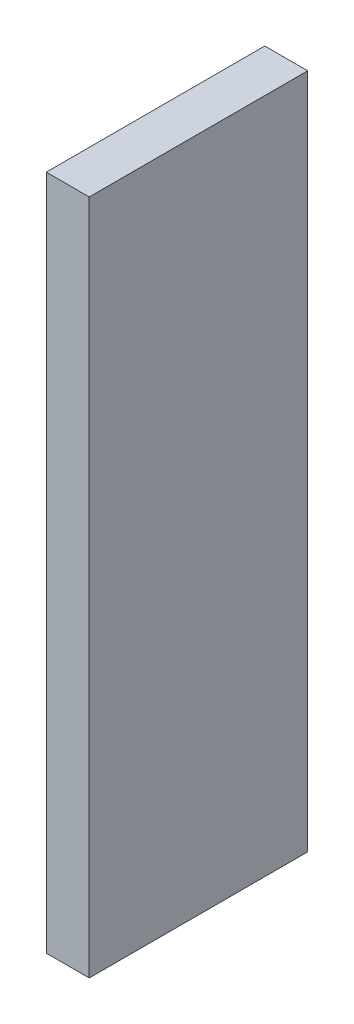
ISO-10303-21;
HEADER;
FILE_DESCRIPTION(('STEP AP214'),'2;1');
FILE_NAME('part.step','',(''),(''),'','','');
FILE_SCHEMA(('AUTOMOTIVE_DESIGN { 1 0 10303 214 1 1 1 1 }'));
ENDSEC;
DATA;
#1=APPLICATION_CONTEXT('core data for automotive mechanical design processes');
#2=APPLICATION_PROTOCOL_DEFINITION('international standard','automotive_design',2000,#1);
#3=PRODUCT_CONTEXT('',#1,'mechanical');
#4=PRODUCT('Part','Part','',(#3));
#5=PRODUCT_RELATED_PRODUCT_CATEGORY('part','',(#4));
#6=PRODUCT_DEFINITION_FORMATION('','',#4);
#7=PRODUCT_DEFINITION_CONTEXT('part definition',#1,'design');
#8=PRODUCT_DEFINITION('design','',#6,#7);
#9=PRODUCT_DEFINITION_SHAPE('','',#8);
#10=(LENGTH_UNIT() NAMED_UNIT(*) SI_UNIT(.MILLI.,.METRE.));
#11=(NAMED_UNIT(*) PLANE_ANGLE_UNIT() SI_UNIT($,.RADIAN.));
#12=(NAMED_UNIT(*) SI_UNIT($,.STERADIAN.) SOLID_ANGLE_UNIT());
#13=UNCERTAINTY_MEASURE_WITH_UNIT(LENGTH_MEASURE(1.E-05),#10,'distance_accuracy_value','');
#14=(GEOMETRIC_REPRESENTATION_CONTEXT(3) GLOBAL_UNCERTAINTY_ASSIGNED_CONTEXT((#13)) GLOBAL_UNIT_ASSIGNED_CONTEXT((#10,
#11,#12)) REPRESENTATION_CONTEXT('',''));
#15=CARTESIAN_POINT('',(0.,0.,0.));
#16=DIRECTION('',(0.,0.,1.));
#17=DIRECTION('',(1.,0.,0.));
#18=AXIS2_PLACEMENT_3D('',#15,#16,#17);
#19=CARTESIAN_POINT('',(6.35,-50.,-16.15));
#20=DIRECTION('',(0.,0.,1.));
#21=DIRECTION('',(1.,0.,0.));
#22=AXIS2_PLACEMENT_3D('',#19,#20,#21);
#23=PLANE('',#22);
#24=DIRECTION('',(0.,1.,0.));
#25=VECTOR('',#24,1.);
#26=CARTESIAN_POINT('',(0.,-50.,-16.15));
#27=LINE('',#26,#25);
#28=CARTESIAN_POINT('',(0.,-50.,-16.15));
#29=VERTEX_POINT('',#28);
#30=CARTESIAN_POINT('',(0.,50.,-16.15));
#31=VERTEX_POINT('',#30);
#32=EDGE_CURVE('E96',#29,#31,#27,.T.);
#33=ORIENTED_EDGE('',*,*,#32,.T.);
#34=DIRECTION('',(-1.,0.,0.));
#35=VECTOR('',#34,1.);
#36=CARTESIAN_POINT('',(6.35,50.,-16.15));
#37=LINE('',#36,#35);
#38=CARTESIAN_POINT('',(6.35,50.,-16.15));
#39=VERTEX_POINT('',#38);
#40=EDGE_CURVE('E11',#39,#31,#37,.T.);
#41=ORIENTED_EDGE('',*,*,#40,.F.);
#42=DIRECTION('',(0.,1.,0.));
#43=VECTOR('',#42,1.);
#44=CARTESIAN_POINT('',(6.35,-50.,-16.15));
#45=LINE('',#44,#43);
#46=CARTESIAN_POINT('',(6.35,-50.,-16.15));
#47=VERTEX_POINT('',#46);
#48=EDGE_CURVE('E84',#47,#39,#45,.T.);
#49=ORIENTED_EDGE('',*,*,#48,.F.);
#50=DIRECTION('',(-1.,0.,0.));
#51=VECTOR('',#50,1.);
#52=CARTESIAN_POINT('',(6.35,-50.,-16.15));
#53=LINE('',#52,#51);
#54=EDGE_CURVE('E92',#47,#29,#53,.T.);
#55=ORIENTED_EDGE('',*,*,#54,.T.);
#56=EDGE_LOOP('',(#33,#41,#49,#55));
#57=FACE_BOUND('',#56,.T.);
#58=ADVANCED_FACE('F33',(#57),#23,.F.);
#59=CARTESIAN_POINT('',(6.35,50.,16.15));
#60=DIRECTION('',(0.,-1.,0.));
#61=DIRECTION('',(0.,0.,-1.));
#62=AXIS2_PLACEMENT_3D('',#59,#60,#61);
#63=PLANE('',#62);
#64=DIRECTION('',(0.,0.,1.));
#65=VECTOR('',#64,1.);
#66=CARTESIAN_POINT('',(0.,50.,16.15));
#67=LINE('',#66,#65);
#68=CARTESIAN_POINT('',(0.,50.,16.15));
#69=VERTEX_POINT('',#68);
#70=EDGE_CURVE('E88',#31,#69,#67,.T.);
#71=ORIENTED_EDGE('',*,*,#70,.T.);
#72=DIRECTION('',(-1.,0.,0.));
#73=VECTOR('',#72,1.);
#74=CARTESIAN_POINT('',(6.35,50.,16.15));
#75=LINE('',#74,#73);
#76=CARTESIAN_POINT('',(6.35,50.,16.15));
#77=VERTEX_POINT('',#76);
#78=EDGE_CURVE('E41',#77,#69,#75,.T.);
#79=ORIENTED_EDGE('',*,*,#78,.F.);
#80=DIRECTION('',(0.,0.,1.));
#81=VECTOR('',#80,1.);
#82=CARTESIAN_POINT('',(6.35,50.,16.15));
#83=LINE('',#82,#81);
#84=EDGE_CURVE('E79',#39,#77,#83,.T.);
#85=ORIENTED_EDGE('',*,*,#84,.F.);
#86=ORIENTED_EDGE('',*,*,#40,.T.);
#87=EDGE_LOOP('',(#71,#79,#85,#86));
#88=FACE_BOUND('',#87,.T.);
#89=ADVANCED_FACE('F87',(#88),#63,.F.);
#90=CARTESIAN_POINT('',(6.35,-50.,16.15));
#91=DIRECTION('',(0.,0.,-1.));
#92=DIRECTION('',(-1.,0.,0.));
#93=AXIS2_PLACEMENT_3D('',#90,#91,#92);
#94=PLANE('',#93);
#95=DIRECTION('',(0.,-1.,0.));
#96=VECTOR('',#95,1.);
#97=CARTESIAN_POINT('',(0.,-50.,16.15));
#98=LINE('',#97,#96);
#99=CARTESIAN_POINT('',(0.,-50.,16.15));
#100=VERTEX_POINT('',#99);
#101=EDGE_CURVE('E66',#69,#100,#98,.T.);
#102=ORIENTED_EDGE('',*,*,#101,.T.);
#103=DIRECTION('',(-1.,0.,0.));
#104=VECTOR('',#103,1.);
#105=CARTESIAN_POINT('',(6.35,-50.,16.15));
#106=LINE('',#105,#104);
#107=CARTESIAN_POINT('',(6.35,-50.,16.15));
#108=VERTEX_POINT('',#107);
#109=EDGE_CURVE('E89',#108,#100,#106,.T.);
#110=ORIENTED_EDGE('',*,*,#109,.F.);
#111=DIRECTION('',(0.,-1.,0.));
#112=VECTOR('',#111,1.);
#113=CARTESIAN_POINT('',(6.35,-50.,16.15));
#114=LINE('',#113,#112);
#115=EDGE_CURVE('E82',#77,#108,#114,.T.);
#116=ORIENTED_EDGE('',*,*,#115,.F.);
#117=ORIENTED_EDGE('',*,*,#78,.T.);
#118=EDGE_LOOP('',(#102,#110,#116,#117));
#119=FACE_BOUND('',#118,.T.);
#120=ADVANCED_FACE('F90',(#119),#94,.F.);
#121=CARTESIAN_POINT('',(6.35,-50.,16.15));
#122=DIRECTION('',(0.,1.,0.));
#123=DIRECTION('',(0.,0.,1.));
#124=AXIS2_PLACEMENT_3D('',#121,#122,#123);
#125=PLANE('',#124);
#126=DIRECTION('',(0.,0.,-1.));
#127=VECTOR('',#126,1.);
#128=CARTESIAN_POINT('',(0.,-50.,16.15));
#129=LINE('',#128,#127);
#130=EDGE_CURVE('E72',#100,#29,#129,.T.);
#131=ORIENTED_EDGE('',*,*,#130,.T.);
#132=ORIENTED_EDGE('',*,*,#54,.F.);
#133=DIRECTION('',(0.,0.,-1.));
#134=VECTOR('',#133,1.);
#135=CARTESIAN_POINT('',(6.35,-50.,16.15));
#136=LINE('',#135,#134);
#137=EDGE_CURVE('E49',#108,#47,#136,.T.);
#138=ORIENTED_EDGE('',*,*,#137,.F.);
#139=ORIENTED_EDGE('',*,*,#109,.T.);
#140=EDGE_LOOP('',(#131,#132,#138,#139));
#141=FACE_BOUND('',#140,.T.);
#142=ADVANCED_FACE('F103',(#141),#125,.F.);
#143=CARTESIAN_POINT('',(6.35,0.,0.));
#144=DIRECTION('',(-1.,0.,0.));
#145=DIRECTION('',(0.,0.,1.));
#146=AXIS2_PLACEMENT_3D('',#143,#144,#145);
#147=PLANE('',#146);
#148=ORIENTED_EDGE('',*,*,#48,.T.);
#149=ORIENTED_EDGE('',*,*,#84,.T.);
#150=ORIENTED_EDGE('',*,*,#115,.T.);
#151=ORIENTED_EDGE('',*,*,#137,.T.);
#152=EDGE_LOOP('',(#148,#149,#150,#151));
#153=FACE_BOUND('',#152,.T.);
#154=ADVANCED_FACE('F80',(#153),#147,.F.);
#155=CARTESIAN_POINT('',(0.,0.,0.));
#156=DIRECTION('',(-1.,0.,0.));
#157=DIRECTION('',(0.,0.,1.));
#158=AXIS2_PLACEMENT_3D('',#155,#156,#157);
#159=PLANE('',#158);
#160=ORIENTED_EDGE('',*,*,#32,.F.);
#161=ORIENTED_EDGE('',*,*,#130,.F.);
#162=ORIENTED_EDGE('',*,*,#101,.F.);
#163=ORIENTED_EDGE('',*,*,#70,.F.);
#164=EDGE_LOOP('',(#160,#161,#162,#163));
#165=FACE_BOUND('',#164,.T.);
#166=ADVANCED_FACE('F106',(#165),#159,.T.);
#167=CLOSED_SHELL('',(#58,#89,#120,#142,#154,#166));
#168=MANIFOLD_SOLID_BREP('B2',#167);
#169=ADVANCED_BREP_SHAPE_REPRESENTATION('',(#18,#168),#14);
#170=SHAPE_DEFINITION_REPRESENTATION(#9,#169);
ENDSEC;
END-ISO-10303-21;
